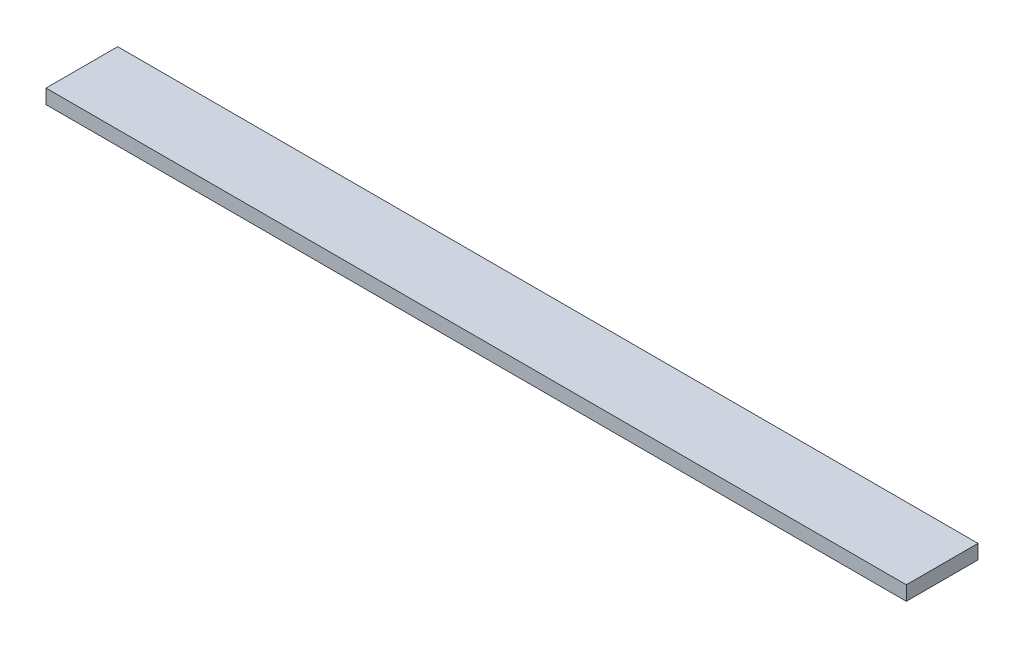
ISO-10303-21;
HEADER;
FILE_DESCRIPTION(('STEP AP214'),'2;1');
FILE_NAME('part.step','',(''),(''),'','','');
FILE_SCHEMA(('AUTOMOTIVE_DESIGN { 1 0 10303 214 1 1 1 1 }'));
ENDSEC;
DATA;
#1=APPLICATION_CONTEXT('core data for automotive mechanical design processes');
#2=APPLICATION_PROTOCOL_DEFINITION('international standard','automotive_design',2000,#1);
#3=PRODUCT_CONTEXT('',#1,'mechanical');
#4=PRODUCT('Part','Part','',(#3));
#5=PRODUCT_RELATED_PRODUCT_CATEGORY('part','',(#4));
#6=PRODUCT_DEFINITION_FORMATION('','',#4);
#7=PRODUCT_DEFINITION_CONTEXT('part definition',#1,'design');
#8=PRODUCT_DEFINITION('design','',#6,#7);
#9=PRODUCT_DEFINITION_SHAPE('','',#8);
#10=(LENGTH_UNIT() NAMED_UNIT(*) SI_UNIT(.MILLI.,.METRE.));
#11=(NAMED_UNIT(*) PLANE_ANGLE_UNIT() SI_UNIT($,.RADIAN.));
#12=(NAMED_UNIT(*) SI_UNIT($,.STERADIAN.) SOLID_ANGLE_UNIT());
#13=UNCERTAINTY_MEASURE_WITH_UNIT(LENGTH_MEASURE(1.E-05),#10,'distance_accuracy_value','');
#14=(GEOMETRIC_REPRESENTATION_CONTEXT(3) GLOBAL_UNCERTAINTY_ASSIGNED_CONTEXT((#13)) GLOBAL_UNIT_ASSIGNED_CONTEXT((#10,
#11,#12)) REPRESENTATION_CONTEXT('',''));
#15=CARTESIAN_POINT('',(0.,0.,0.));
#16=DIRECTION('',(0.,0.,1.));
#17=DIRECTION('',(1.,0.,0.));
#18=AXIS2_PLACEMENT_3D('',#15,#16,#17);
#19=CARTESIAN_POINT('',(152.4,5.08,12.7));
#20=DIRECTION('',(-1.,0.,0.));
#21=DIRECTION('',(0.,0.,1.));
#22=AXIS2_PLACEMENT_3D('',#19,#20,#21);
#23=PLANE('',#22);
#24=DIRECTION('',(0.,0.,-1.));
#25=VECTOR('',#24,1.);
#26=CARTESIAN_POINT('',(152.4,0.,12.7));
#27=LINE('',#26,#25);
#28=CARTESIAN_POINT('',(152.4,0.,12.7));
#29=VERTEX_POINT('',#28);
#30=CARTESIAN_POINT('',(152.4,0.,-12.7));
#31=VERTEX_POINT('',#30);
#32=EDGE_CURVE('E107',#29,#31,#27,.T.);
#33=ORIENTED_EDGE('',*,*,#32,.T.);
#34=DIRECTION('',(0.,-1.,0.));
#35=VECTOR('',#34,1.);
#36=CARTESIAN_POINT('',(152.4,5.08,-12.7));
#37=LINE('',#36,#35);
#38=CARTESIAN_POINT('',(152.4,5.08,-12.7));
#39=VERTEX_POINT('',#38);
#40=EDGE_CURVE('E11',#39,#31,#37,.T.);
#41=ORIENTED_EDGE('',*,*,#40,.F.);
#42=DIRECTION('',(0.,0.,-1.));
#43=VECTOR('',#42,1.);
#44=CARTESIAN_POINT('',(152.4,5.08,12.7));
#45=LINE('',#44,#43);
#46=CARTESIAN_POINT('',(152.4,5.08,12.7));
#47=VERTEX_POINT('',#46);
#48=EDGE_CURVE('E91',#47,#39,#45,.T.);
#49=ORIENTED_EDGE('',*,*,#48,.F.);
#50=DIRECTION('',(0.,-1.,0.));
#51=VECTOR('',#50,1.);
#52=CARTESIAN_POINT('',(152.4,5.08,12.7));
#53=LINE('',#52,#51);
#54=EDGE_CURVE('E103',#47,#29,#53,.T.);
#55=ORIENTED_EDGE('',*,*,#54,.T.);
#56=EDGE_LOOP('',(#33,#41,#49,#55));
#57=FACE_BOUND('',#56,.T.);
#58=ADVANCED_FACE('F39',(#57),#23,.F.);
#59=CARTESIAN_POINT('',(-152.4,5.08,-12.7));
#60=DIRECTION('',(0.,0.,1.));
#61=DIRECTION('',(1.,0.,0.));
#62=AXIS2_PLACEMENT_3D('',#59,#60,#61);
#63=PLANE('',#62);
#64=DIRECTION('',(-1.,0.,0.));
#65=VECTOR('',#64,1.);
#66=CARTESIAN_POINT('',(-152.4,0.,-12.7));
#67=LINE('',#66,#65);
#68=CARTESIAN_POINT('',(-152.4,0.,-12.7));
#69=VERTEX_POINT('',#68);
#70=EDGE_CURVE('E96',#31,#69,#67,.T.);
#71=ORIENTED_EDGE('',*,*,#70,.T.);
#72=DIRECTION('',(0.,-1.,0.));
#73=VECTOR('',#72,1.);
#74=CARTESIAN_POINT('',(-152.4,5.08,-12.7));
#75=LINE('',#74,#73);
#76=CARTESIAN_POINT('',(-152.4,5.08,-12.7));
#77=VERTEX_POINT('',#76);
#78=EDGE_CURVE('E48',#77,#69,#75,.T.);
#79=ORIENTED_EDGE('',*,*,#78,.F.);
#80=DIRECTION('',(-1.,0.,0.));
#81=VECTOR('',#80,1.);
#82=CARTESIAN_POINT('',(-152.4,5.08,-12.7));
#83=LINE('',#82,#81);
#84=EDGE_CURVE('E86',#39,#77,#83,.T.);
#85=ORIENTED_EDGE('',*,*,#84,.F.);
#86=ORIENTED_EDGE('',*,*,#40,.T.);
#87=EDGE_LOOP('',(#71,#79,#85,#86));
#88=FACE_BOUND('',#87,.T.);
#89=ADVANCED_FACE('F95',(#88),#63,.F.);
#90=CARTESIAN_POINT('',(-152.4,5.08,12.7));
#91=DIRECTION('',(1.,0.,0.));
#92=DIRECTION('',(0.,0.,-1.));
#93=AXIS2_PLACEMENT_3D('',#90,#91,#92);
#94=PLANE('',#93);
#95=DIRECTION('',(0.,0.,1.));
#96=VECTOR('',#95,1.);
#97=CARTESIAN_POINT('',(-152.4,0.,12.7));
#98=LINE('',#97,#96);
#99=CARTESIAN_POINT('',(-152.4,0.,12.7));
#100=VERTEX_POINT('',#99);
#101=EDGE_CURVE('E73',#69,#100,#98,.T.);
#102=ORIENTED_EDGE('',*,*,#101,.T.);
#103=DIRECTION('',(0.,-1.,0.));
#104=VECTOR('',#103,1.);
#105=CARTESIAN_POINT('',(-152.4,5.08,12.7));
#106=LINE('',#105,#104);
#107=CARTESIAN_POINT('',(-152.4,5.08,12.7));
#108=VERTEX_POINT('',#107);
#109=EDGE_CURVE('E98',#108,#100,#106,.T.);
#110=ORIENTED_EDGE('',*,*,#109,.F.);
#111=DIRECTION('',(0.,0.,1.));
#112=VECTOR('',#111,1.);
#113=CARTESIAN_POINT('',(-152.4,5.08,12.7));
#114=LINE('',#113,#112);
#115=EDGE_CURVE('E89',#77,#108,#114,.T.);
#116=ORIENTED_EDGE('',*,*,#115,.F.);
#117=ORIENTED_EDGE('',*,*,#78,.T.);
#118=EDGE_LOOP('',(#102,#110,#116,#117));
#119=FACE_BOUND('',#118,.T.);
#120=ADVANCED_FACE('F99',(#119),#94,.F.);
#121=CARTESIAN_POINT('',(-152.4,5.08,12.7));
#122=DIRECTION('',(0.,0.,-1.));
#123=DIRECTION('',(-1.,0.,0.));
#124=AXIS2_PLACEMENT_3D('',#121,#122,#123);
#125=PLANE('',#124);
#126=DIRECTION('',(1.,0.,0.));
#127=VECTOR('',#126,1.);
#128=CARTESIAN_POINT('',(-152.4,0.,12.7));
#129=LINE('',#128,#127);
#130=EDGE_CURVE('E79',#100,#29,#129,.T.);
#131=ORIENTED_EDGE('',*,*,#130,.T.);
#132=ORIENTED_EDGE('',*,*,#54,.F.);
#133=DIRECTION('',(1.,0.,0.));
#134=VECTOR('',#133,1.);
#135=CARTESIAN_POINT('',(-152.4,5.08,12.7));
#136=LINE('',#135,#134);
#137=EDGE_CURVE('E56',#108,#47,#136,.T.);
#138=ORIENTED_EDGE('',*,*,#137,.F.);
#139=ORIENTED_EDGE('',*,*,#109,.T.);
#140=EDGE_LOOP('',(#131,#132,#138,#139));
#141=FACE_BOUND('',#140,.T.);
#142=ADVANCED_FACE('F120',(#141),#125,.F.);
#143=CARTESIAN_POINT('',(0.,5.08,0.));
#144=DIRECTION('',(0.,-1.,0.));
#145=DIRECTION('',(0.,0.,-1.));
#146=AXIS2_PLACEMENT_3D('',#143,#144,#145);
#147=PLANE('',#146);
#148=ORIENTED_EDGE('',*,*,#48,.T.);
#149=ORIENTED_EDGE('',*,*,#84,.T.);
#150=ORIENTED_EDGE('',*,*,#115,.T.);
#151=ORIENTED_EDGE('',*,*,#137,.T.);
#152=EDGE_LOOP('',(#148,#149,#150,#151));
#153=FACE_BOUND('',#152,.T.);
#154=ADVANCED_FACE('F87',(#153),#147,.F.);
#155=CARTESIAN_POINT('',(0.,0.,0.));
#156=DIRECTION('',(0.,-1.,0.));
#157=DIRECTION('',(0.,0.,-1.));
#158=AXIS2_PLACEMENT_3D('',#155,#156,#157);
#159=PLANE('',#158);
#160=ORIENTED_EDGE('',*,*,#32,.F.);
#161=ORIENTED_EDGE('',*,*,#130,.F.);
#162=ORIENTED_EDGE('',*,*,#101,.F.);
#163=ORIENTED_EDGE('',*,*,#70,.F.);
#164=EDGE_LOOP('',(#160,#161,#162,#163));
#165=FACE_BOUND('',#164,.T.);
#166=ADVANCED_FACE('F123',(#165),#159,.T.);
#167=CLOSED_SHELL('',(#58,#89,#120,#142,#154,#166));
#168=MANIFOLD_SOLID_BREP('B2',#167);
#169=ADVANCED_BREP_SHAPE_REPRESENTATION('',(#18,#168),#14);
#170=SHAPE_DEFINITION_REPRESENTATION(#9,#169);
ENDSEC;
END-ISO-10303-21;
